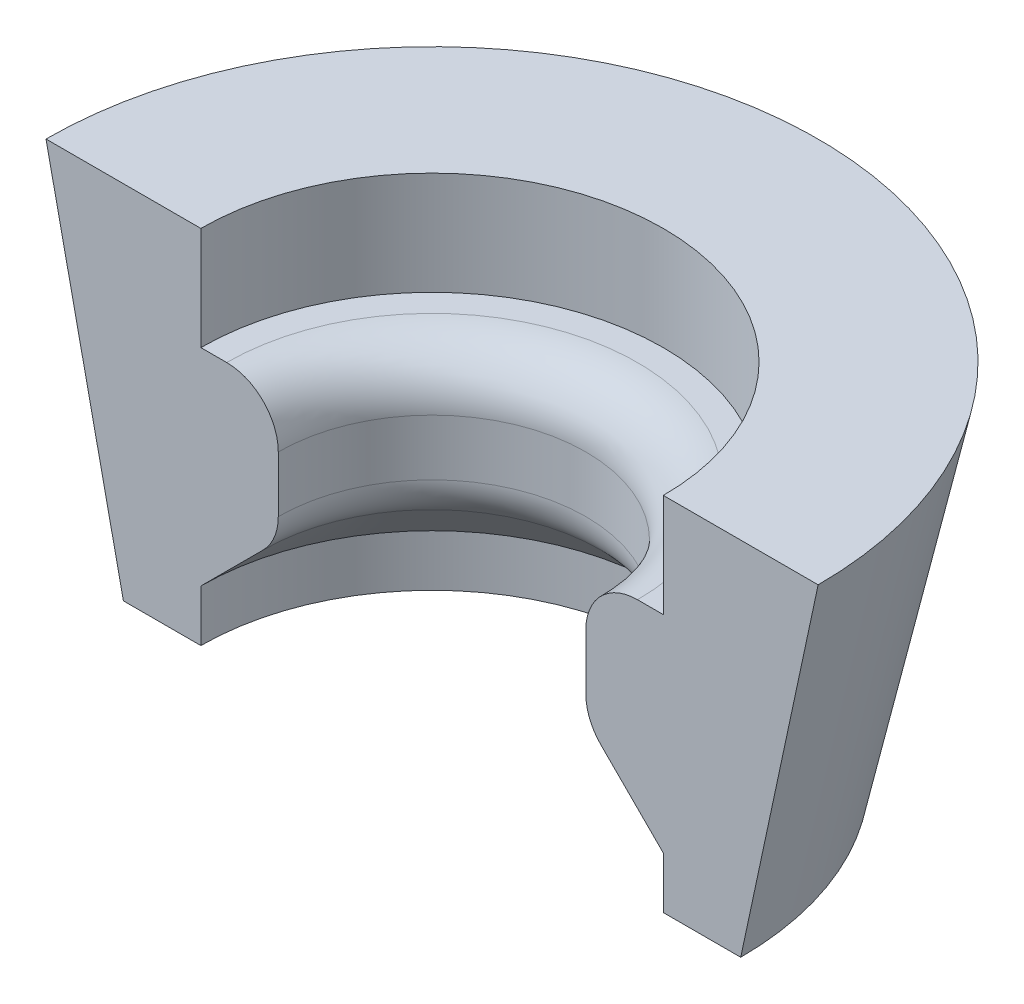
ISO-10303-21;
HEADER;
FILE_DESCRIPTION(('STEP AP214'),'2;1');
FILE_NAME('part.step','',(''),(''),'','','');
FILE_SCHEMA(('AUTOMOTIVE_DESIGN { 1 0 10303 214 1 1 1 1 }'));
ENDSEC;
DATA;
#1=APPLICATION_CONTEXT('core data for automotive mechanical design processes');
#2=APPLICATION_PROTOCOL_DEFINITION('international standard','automotive_design',2000,#1);
#3=PRODUCT_CONTEXT('',#1,'mechanical');
#4=PRODUCT('Part','Part','',(#3));
#5=PRODUCT_RELATED_PRODUCT_CATEGORY('part','',(#4));
#6=PRODUCT_DEFINITION_FORMATION('','',#4);
#7=PRODUCT_DEFINITION_CONTEXT('part definition',#1,'design');
#8=PRODUCT_DEFINITION('design','',#6,#7);
#9=PRODUCT_DEFINITION_SHAPE('','',#8);
#10=(LENGTH_UNIT() NAMED_UNIT(*) SI_UNIT(.MILLI.,.METRE.));
#11=(NAMED_UNIT(*) PLANE_ANGLE_UNIT() SI_UNIT($,.RADIAN.));
#12=(NAMED_UNIT(*) SI_UNIT($,.STERADIAN.) SOLID_ANGLE_UNIT());
#13=UNCERTAINTY_MEASURE_WITH_UNIT(LENGTH_MEASURE(1.E-05),#10,'distance_accuracy_value','');
#14=(GEOMETRIC_REPRESENTATION_CONTEXT(3) GLOBAL_UNCERTAINTY_ASSIGNED_CONTEXT((#13)) GLOBAL_UNIT_ASSIGNED_CONTEXT((#10,
#11,#12)) REPRESENTATION_CONTEXT('',''));
#15=CARTESIAN_POINT('',(0.,0.,0.));
#16=DIRECTION('',(0.,0.,1.));
#17=DIRECTION('',(1.,0.,0.));
#18=AXIS2_PLACEMENT_3D('',#15,#16,#17);
#19=CARTESIAN_POINT('',(3.556,1.5875,0.));
#20=DIRECTION('',(0.,1.,0.));
#21=DIRECTION('',(-1.,0.,0.));
#22=AXIS2_PLACEMENT_3D('',#19,#20,#21);
#23=PLANE('',#22);
#24=CARTESIAN_POINT('',(0.,1.5875,0.));
#25=DIRECTION('',(0.,1.,0.));
#26=DIRECTION('',(-1.,0.,0.));
#27=AXIS2_PLACEMENT_3D('',#24,#25,#26);
#28=CIRCLE('',#27,3.159125);
#29=CARTESIAN_POINT('',(3.15912500000001,1.5875,0.));
#30=VERTEX_POINT('',#29);
#31=CARTESIAN_POINT('',(-3.159125,1.5875,0.));
#32=VERTEX_POINT('',#31);
#33=EDGE_CURVE('E11',#30,#32,#28,.T.);
#34=ORIENTED_EDGE('',*,*,#33,.F.);
#35=DIRECTION('',(1.,0.,0.));
#36=VECTOR('',#35,1.);
#37=CARTESIAN_POINT('',(3.556,1.5875,0.));
#38=LINE('',#37,#36);
#39=CARTESIAN_POINT('',(3.556,1.5875,0.));
#40=VERTEX_POINT('',#39);
#41=EDGE_CURVE('E111',#30,#40,#38,.T.);
#42=ORIENTED_EDGE('',*,*,#41,.T.);
#43=CARTESIAN_POINT('',(0.,1.5875,0.));
#44=DIRECTION('',(0.,1.,0.));
#45=DIRECTION('',(-1.,0.,0.));
#46=AXIS2_PLACEMENT_3D('',#43,#44,#45);
#47=CIRCLE('',#46,3.556);
#48=CARTESIAN_POINT('',(-3.556,1.5875,0.));
#49=VERTEX_POINT('',#48);
#50=EDGE_CURVE('E106',#40,#49,#47,.T.);
#51=ORIENTED_EDGE('',*,*,#50,.T.);
#52=DIRECTION('',(-1.,0.,0.));
#53=VECTOR('',#52,1.);
#54=CARTESIAN_POINT('',(-3.556,1.5875,0.));
#55=LINE('',#54,#53);
#56=EDGE_CURVE('E109',#32,#49,#55,.T.);
#57=ORIENTED_EDGE('',*,*,#56,.F.);
#58=EDGE_LOOP('',(#34,#42,#51,#57));
#59=FACE_BOUND('',#58,.T.);
#60=ADVANCED_FACE('F34',(#59),#23,.T.);
#61=CARTESIAN_POINT('',(0.,0.793750000000001,0.));
#62=DIRECTION('',(0.,1.,0.));
#63=DIRECTION('',(-1.,0.,0.));
#64=AXIS2_PLACEMENT_3D('',#61,#62,#63);
#65=TOROIDAL_SURFACE('',#64,3.159125,0.79375);
#66=CARTESIAN_POINT('',(0.,0.793749999999995,0.));
#67=DIRECTION('',(0.,1.,0.));
#68=DIRECTION('',(-1.,0.,0.));
#69=AXIS2_PLACEMENT_3D('',#66,#67,#68);
#70=CIRCLE('',#69,2.365375);
#71=CARTESIAN_POINT('',(2.365375,0.793749999999996,0.));
#72=VERTEX_POINT('',#71);
#73=CARTESIAN_POINT('',(-2.365375,0.793749999999995,0.));
#74=VERTEX_POINT('',#73);
#75=EDGE_CURVE('E42',#72,#74,#70,.T.);
#76=ORIENTED_EDGE('',*,*,#75,.F.);
#77=CARTESIAN_POINT('',(3.159125,0.793750000000001,0.));
#78=DIRECTION('',(0.,0.,-1.));
#79=DIRECTION('',(1.,0.,0.));
#80=AXIS2_PLACEMENT_3D('',#77,#78,#79);
#81=CIRCLE('',#80,0.79375);
#82=EDGE_CURVE('E116',#72,#30,#81,.T.);
#83=ORIENTED_EDGE('',*,*,#82,.T.);
#84=ORIENTED_EDGE('',*,*,#33,.T.);
#85=CARTESIAN_POINT('',(-3.159125,0.793750000000001,0.));
#86=DIRECTION('',(0.,0.,1.));
#87=DIRECTION('',(-1.,0.,0.));
#88=AXIS2_PLACEMENT_3D('',#85,#86,#87);
#89=CIRCLE('',#88,0.79375);
#90=EDGE_CURVE('E129',#74,#32,#89,.T.);
#91=ORIENTED_EDGE('',*,*,#90,.F.);
#92=EDGE_LOOP('',(#76,#83,#84,#91));
#93=FACE_BOUND('',#92,.T.);
#94=ADVANCED_FACE('F36',(#93),#65,.T.);
#95=CARTESIAN_POINT('',(0.,1.5875,0.));
#96=DIRECTION('',(0.,1.,0.));
#97=DIRECTION('',(-1.,0.,0.));
#98=AXIS2_PLACEMENT_3D('',#95,#96,#97);
#99=CYLINDRICAL_SURFACE('',#98,2.365375);
#100=CARTESIAN_POINT('',(0.,-0.0680929848663647,0.));
#101=DIRECTION('',(0.,1.,0.));
#102=DIRECTION('',(-1.,0.,0.));
#103=AXIS2_PLACEMENT_3D('',#100,#101,#102);
#104=CIRCLE('',#103,2.365375);
#105=CARTESIAN_POINT('',(2.365375,-0.0680929848663646,0.));
#106=VERTEX_POINT('',#105);
#107=CARTESIAN_POINT('',(-2.365375,-0.0680929848663652,0.));
#108=VERTEX_POINT('',#107);
#109=EDGE_CURVE('E186',#106,#108,#104,.T.);
#110=ORIENTED_EDGE('',*,*,#109,.F.);
#111=DIRECTION('',(0.,1.,0.));
#112=VECTOR('',#111,1.);
#113=CARTESIAN_POINT('',(2.365375,0.793749999999996,0.));
#114=LINE('',#113,#112);
#115=EDGE_CURVE('E172',#106,#72,#114,.T.);
#116=ORIENTED_EDGE('',*,*,#115,.T.);
#117=ORIENTED_EDGE('',*,*,#75,.T.);
#118=DIRECTION('',(0.,1.,0.));
#119=VECTOR('',#118,1.);
#120=CARTESIAN_POINT('',(-2.365375,0.793749999999995,0.));
#121=LINE('',#120,#119);
#122=EDGE_CURVE('E148',#108,#74,#121,.T.);
#123=ORIENTED_EDGE('',*,*,#122,.F.);
#124=EDGE_LOOP('',(#110,#116,#117,#123));
#125=FACE_BOUND('',#124,.T.);
#126=ADVANCED_FACE('F189',(#125),#99,.F.);
#127=CARTESIAN_POINT('',(0.,-0.0680929848663642,0.));
#128=DIRECTION('',(0.,1.,0.));
#129=DIRECTION('',(-1.,0.,0.));
#130=AXIS2_PLACEMENT_3D('',#127,#128,#129);
#131=TOROIDAL_SURFACE('',#130,3.159125,0.79375);
#132=CARTESIAN_POINT('',(0.,-0.62935899243319,0.));
#133=DIRECTION('',(0.,1.,0.));
#134=DIRECTION('',(-1.,0.,0.));
#135=AXIS2_PLACEMENT_3D('',#132,#133,#134);
#136=CIRCLE('',#135,2.59785899243318);
#137=CARTESIAN_POINT('',(2.59785899243318,-0.629358992433189,0.));
#138=VERTEX_POINT('',#137);
#139=CARTESIAN_POINT('',(-2.59785899243318,-0.62935899243319,0.));
#140=VERTEX_POINT('',#139);
#141=EDGE_CURVE('E184',#138,#140,#136,.T.);
#142=ORIENTED_EDGE('',*,*,#141,.F.);
#143=CARTESIAN_POINT('',(3.159125,-0.0680929848663638,0.));
#144=DIRECTION('',(0.,0.,-1.));
#145=DIRECTION('',(1.,0.,0.));
#146=AXIS2_PLACEMENT_3D('',#143,#144,#145);
#147=CIRCLE('',#146,0.79375);
#148=EDGE_CURVE('E169',#138,#106,#147,.T.);
#149=ORIENTED_EDGE('',*,*,#148,.T.);
#150=ORIENTED_EDGE('',*,*,#109,.T.);
#151=CARTESIAN_POINT('',(-3.159125,-0.0680929848663646,0.));
#152=DIRECTION('',(0.,0.,1.));
#153=DIRECTION('',(-1.,0.,0.));
#154=AXIS2_PLACEMENT_3D('',#151,#152,#153);
#155=CIRCLE('',#154,0.79375);
#156=EDGE_CURVE('E145',#140,#108,#155,.T.);
#157=ORIENTED_EDGE('',*,*,#156,.F.);
#158=EDGE_LOOP('',(#142,#149,#150,#157));
#159=FACE_BOUND('',#158,.T.);
#160=ADVANCED_FACE('F216',(#159),#131,.T.);
#161=CARTESIAN_POINT('',(0.,-1.5875,0.));
#162=DIRECTION('',(0.,-1.,0.));
#163=DIRECTION('',(1.,0.,0.));
#164=AXIS2_PLACEMENT_3D('',#161,#162,#163);
#165=CONICAL_SURFACE('',#164,3.556,0.785398163397453);
#166=CARTESIAN_POINT('',(0.,-1.5875,0.));
#167=DIRECTION('',(0.,1.,0.));
#168=DIRECTION('',(-1.,0.,0.));
#169=AXIS2_PLACEMENT_3D('',#166,#167,#168);
#170=CIRCLE('',#169,3.556);
#171=CARTESIAN_POINT('',(3.556,-1.5875,0.));
#172=VERTEX_POINT('',#171);
#173=CARTESIAN_POINT('',(-3.556,-1.5875,0.));
#174=VERTEX_POINT('',#173);
#175=EDGE_CURVE('E182',#172,#174,#170,.T.);
#176=ORIENTED_EDGE('',*,*,#175,.F.);
#177=DIRECTION('',(-0.707106781186551,0.707106781186544,0.));
#178=VECTOR('',#177,1.);
#179=CARTESIAN_POINT('',(2.59785899243318,-0.629358992433189,0.));
#180=LINE('',#179,#178);
#181=EDGE_CURVE('E166',#172,#138,#180,.T.);
#182=ORIENTED_EDGE('',*,*,#181,.T.);
#183=ORIENTED_EDGE('',*,*,#141,.T.);
#184=DIRECTION('',(0.707106781186551,0.707106781186544,0.));
#185=VECTOR('',#184,1.);
#186=CARTESIAN_POINT('',(-2.59785899243318,-0.62935899243319,0.));
#187=LINE('',#186,#185);
#188=EDGE_CURVE('E142',#174,#140,#187,.T.);
#189=ORIENTED_EDGE('',*,*,#188,.F.);
#190=EDGE_LOOP('',(#176,#182,#183,#189));
#191=FACE_BOUND('',#190,.T.);
#192=ADVANCED_FACE('F213',(#191),#165,.F.);
#193=CARTESIAN_POINT('',(0.,1.5875,0.));
#194=DIRECTION('',(0.,1.,0.));
#195=DIRECTION('',(-1.,0.,0.));
#196=AXIS2_PLACEMENT_3D('',#193,#194,#195);
#197=CYLINDRICAL_SURFACE('',#196,3.556);
#198=CARTESIAN_POINT('',(0.,-2.38125,0.));
#199=DIRECTION('',(0.,1.,0.));
#200=DIRECTION('',(-1.,0.,0.));
#201=AXIS2_PLACEMENT_3D('',#198,#199,#200);
#202=CIRCLE('',#201,3.556);
#203=CARTESIAN_POINT('',(3.556,-2.38125,0.));
#204=VERTEX_POINT('',#203);
#205=CARTESIAN_POINT('',(-3.556,-2.38125,0.));
#206=VERTEX_POINT('',#205);
#207=EDGE_CURVE('E180',#204,#206,#202,.T.);
#208=ORIENTED_EDGE('',*,*,#207,.F.);
#209=DIRECTION('',(0.,1.,0.));
#210=VECTOR('',#209,1.);
#211=CARTESIAN_POINT('',(3.556,-2.38125,0.));
#212=LINE('',#211,#210);
#213=EDGE_CURVE('E163',#204,#172,#212,.T.);
#214=ORIENTED_EDGE('',*,*,#213,.T.);
#215=ORIENTED_EDGE('',*,*,#175,.T.);
#216=DIRECTION('',(0.,1.,0.));
#217=VECTOR('',#216,1.);
#218=CARTESIAN_POINT('',(-3.556,-2.38125,0.));
#219=LINE('',#218,#217);
#220=EDGE_CURVE('E139',#206,#174,#219,.T.);
#221=ORIENTED_EDGE('',*,*,#220,.F.);
#222=EDGE_LOOP('',(#208,#214,#215,#221));
#223=FACE_BOUND('',#222,.T.);
#224=ADVANCED_FACE('F210',(#223),#197,.F.);
#225=CARTESIAN_POINT('',(4.746625,-2.38125,0.));
#226=DIRECTION('',(0.,-1.,0.));
#227=DIRECTION('',(1.,0.,0.));
#228=AXIS2_PLACEMENT_3D('',#225,#226,#227);
#229=PLANE('',#228);
#230=CARTESIAN_POINT('',(0.,-2.38125,0.));
#231=DIRECTION('',(0.,1.,0.));
#232=DIRECTION('',(-1.,0.,0.));
#233=AXIS2_PLACEMENT_3D('',#230,#231,#232);
#234=CIRCLE('',#233,4.746625);
#235=CARTESIAN_POINT('',(4.746625,-2.38125,0.));
#236=VERTEX_POINT('',#235);
#237=CARTESIAN_POINT('',(-4.746625,-2.38125,0.));
#238=VERTEX_POINT('',#237);
#239=EDGE_CURVE('E178',#236,#238,#234,.T.);
#240=ORIENTED_EDGE('',*,*,#239,.F.);
#241=DIRECTION('',(-1.,0.,0.));
#242=VECTOR('',#241,1.);
#243=CARTESIAN_POINT('',(4.746625,-2.38125,0.));
#244=LINE('',#243,#242);
#245=EDGE_CURVE('E160',#236,#204,#244,.T.);
#246=ORIENTED_EDGE('',*,*,#245,.T.);
#247=ORIENTED_EDGE('',*,*,#207,.T.);
#248=DIRECTION('',(1.,0.,0.));
#249=VECTOR('',#248,1.);
#250=CARTESIAN_POINT('',(-4.746625,-2.38125,0.));
#251=LINE('',#250,#249);
#252=EDGE_CURVE('E136',#238,#206,#251,.T.);
#253=ORIENTED_EDGE('',*,*,#252,.F.);
#254=EDGE_LOOP('',(#240,#246,#247,#253));
#255=FACE_BOUND('',#254,.T.);
#256=ADVANCED_FACE('F205',(#255),#229,.T.);
#257=CARTESIAN_POINT('',(0.,3.175,0.));
#258=DIRECTION('',(0.,1.,0.));
#259=DIRECTION('',(-1.,0.,0.));
#260=AXIS2_PLACEMENT_3D('',#257,#258,#259);
#261=CONICAL_SURFACE('',#260,5.93725,0.211093333222746);
#262=CARTESIAN_POINT('',(0.,3.175,0.));
#263=DIRECTION('',(0.,1.,0.));
#264=DIRECTION('',(-1.,0.,0.));
#265=AXIS2_PLACEMENT_3D('',#262,#263,#264);
#266=CIRCLE('',#265,5.93725);
#267=CARTESIAN_POINT('',(5.93725,3.175,0.));
#268=VERTEX_POINT('',#267);
#269=CARTESIAN_POINT('',(-5.93725,3.175,0.));
#270=VERTEX_POINT('',#269);
#271=EDGE_CURVE('E176',#268,#270,#266,.T.);
#272=ORIENTED_EDGE('',*,*,#271,.F.);
#273=DIRECTION('',(-0.209529088730873,-0.97780241407741,0.));
#274=VECTOR('',#273,1.);
#275=CARTESIAN_POINT('',(5.93725,3.175,0.));
#276=LINE('',#275,#274);
#277=EDGE_CURVE('E157',#268,#236,#276,.T.);
#278=ORIENTED_EDGE('',*,*,#277,.T.);
#279=ORIENTED_EDGE('',*,*,#239,.T.);
#280=DIRECTION('',(0.209529088730873,-0.977802414077409,0.));
#281=VECTOR('',#280,1.);
#282=CARTESIAN_POINT('',(-5.93725,3.175,0.));
#283=LINE('',#282,#281);
#284=EDGE_CURVE('E133',#270,#238,#283,.T.);
#285=ORIENTED_EDGE('',*,*,#284,.F.);
#286=EDGE_LOOP('',(#272,#278,#279,#285));
#287=FACE_BOUND('',#286,.T.);
#288=ADVANCED_FACE('F203',(#287),#261,.T.);
#289=CARTESIAN_POINT('',(3.556,3.175,0.));
#290=DIRECTION('',(0.,1.,0.));
#291=DIRECTION('',(-1.,0.,0.));
#292=AXIS2_PLACEMENT_3D('',#289,#290,#291);
#293=PLANE('',#292);
#294=CARTESIAN_POINT('',(0.,3.175,0.));
#295=DIRECTION('',(0.,1.,0.));
#296=DIRECTION('',(-1.,0.,0.));
#297=AXIS2_PLACEMENT_3D('',#294,#295,#296);
#298=CIRCLE('',#297,3.556);
#299=CARTESIAN_POINT('',(3.556,3.175,0.));
#300=VERTEX_POINT('',#299);
#301=CARTESIAN_POINT('',(-3.556,3.175,0.));
#302=VERTEX_POINT('',#301);
#303=EDGE_CURVE('E115',#300,#302,#298,.T.);
#304=ORIENTED_EDGE('',*,*,#303,.F.);
#305=DIRECTION('',(1.,0.,0.));
#306=VECTOR('',#305,1.);
#307=CARTESIAN_POINT('',(3.556,3.175,0.));
#308=LINE('',#307,#306);
#309=EDGE_CURVE('E154',#300,#268,#308,.T.);
#310=ORIENTED_EDGE('',*,*,#309,.T.);
#311=ORIENTED_EDGE('',*,*,#271,.T.);
#312=DIRECTION('',(-1.,0.,0.));
#313=VECTOR('',#312,1.);
#314=CARTESIAN_POINT('',(-3.556,3.175,0.));
#315=LINE('',#314,#313);
#316=EDGE_CURVE('E124',#302,#270,#315,.T.);
#317=ORIENTED_EDGE('',*,*,#316,.F.);
#318=EDGE_LOOP('',(#304,#310,#311,#317));
#319=FACE_BOUND('',#318,.T.);
#320=ADVANCED_FACE('F199',(#319),#293,.T.);
#321=CARTESIAN_POINT('',(0.,1.5875,0.));
#322=DIRECTION('',(0.,1.,0.));
#323=DIRECTION('',(-1.,0.,0.));
#324=AXIS2_PLACEMENT_3D('',#321,#322,#323);
#325=CYLINDRICAL_SURFACE('',#324,3.556);
#326=DIRECTION('',(0.,1.,0.));
#327=VECTOR('',#326,1.);
#328=CARTESIAN_POINT('',(3.556,1.5875,0.));
#329=LINE('',#328,#327);
#330=EDGE_CURVE('E152',#40,#300,#329,.T.);
#331=ORIENTED_EDGE('',*,*,#330,.T.);
#332=ORIENTED_EDGE('',*,*,#303,.T.);
#333=DIRECTION('',(0.,1.,0.));
#334=VECTOR('',#333,1.);
#335=CARTESIAN_POINT('',(-3.556,1.5875,0.));
#336=LINE('',#335,#334);
#337=EDGE_CURVE('E119',#49,#302,#336,.T.);
#338=ORIENTED_EDGE('',*,*,#337,.F.);
#339=ORIENTED_EDGE('',*,*,#50,.F.);
#340=EDGE_LOOP('',(#331,#332,#338,#339));
#341=FACE_BOUND('',#340,.T.);
#342=ADVANCED_FACE('F120',(#341),#325,.F.);
#343=CARTESIAN_POINT('',(3.159125,0.793750000000001,0.));
#344=DIRECTION('',(0.,0.,1.));
#345=DIRECTION('',(1.,0.,0.));
#346=AXIS2_PLACEMENT_3D('',#343,#344,#345);
#347=PLANE('',#346);
#348=ORIENTED_EDGE('',*,*,#41,.F.);
#349=ORIENTED_EDGE('',*,*,#82,.F.);
#350=ORIENTED_EDGE('',*,*,#115,.F.);
#351=ORIENTED_EDGE('',*,*,#148,.F.);
#352=ORIENTED_EDGE('',*,*,#181,.F.);
#353=ORIENTED_EDGE('',*,*,#213,.F.);
#354=ORIENTED_EDGE('',*,*,#245,.F.);
#355=ORIENTED_EDGE('',*,*,#277,.F.);
#356=ORIENTED_EDGE('',*,*,#309,.F.);
#357=ORIENTED_EDGE('',*,*,#330,.F.);
#358=EDGE_LOOP('',(#348,#349,#350,#351,#352,#353,#354,#355,#356,#357));
#359=FACE_BOUND('',#358,.T.);
#360=ADVANCED_FACE('F194',(#359),#347,.T.);
#361=CARTESIAN_POINT('',(-3.159125,0.793750000000001,0.));
#362=DIRECTION('',(0.,0.,-1.));
#363=DIRECTION('',(-1.,0.,0.));
#364=AXIS2_PLACEMENT_3D('',#361,#362,#363);
#365=PLANE('',#364);
#366=ORIENTED_EDGE('',*,*,#56,.T.);
#367=ORIENTED_EDGE('',*,*,#337,.T.);
#368=ORIENTED_EDGE('',*,*,#316,.T.);
#369=ORIENTED_EDGE('',*,*,#284,.T.);
#370=ORIENTED_EDGE('',*,*,#252,.T.);
#371=ORIENTED_EDGE('',*,*,#220,.T.);
#372=ORIENTED_EDGE('',*,*,#188,.T.);
#373=ORIENTED_EDGE('',*,*,#156,.T.);
#374=ORIENTED_EDGE('',*,*,#122,.T.);
#375=ORIENTED_EDGE('',*,*,#90,.T.);
#376=EDGE_LOOP('',(#366,#367,#368,#369,#370,#371,#372,#373,#374,#375));
#377=FACE_BOUND('',#376,.T.);
#378=ADVANCED_FACE('F127',(#377),#365,.F.);
#379=CLOSED_SHELL('',(#60,#94,#126,#160,#192,#224,#256,#288,#320,#342,#360,#378));
#380=MANIFOLD_SOLID_BREP('B2',#379);
#381=ADVANCED_BREP_SHAPE_REPRESENTATION('',(#18,#380),#14);
#382=SHAPE_DEFINITION_REPRESENTATION(#9,#381);
ENDSEC;
END-ISO-10303-21;
